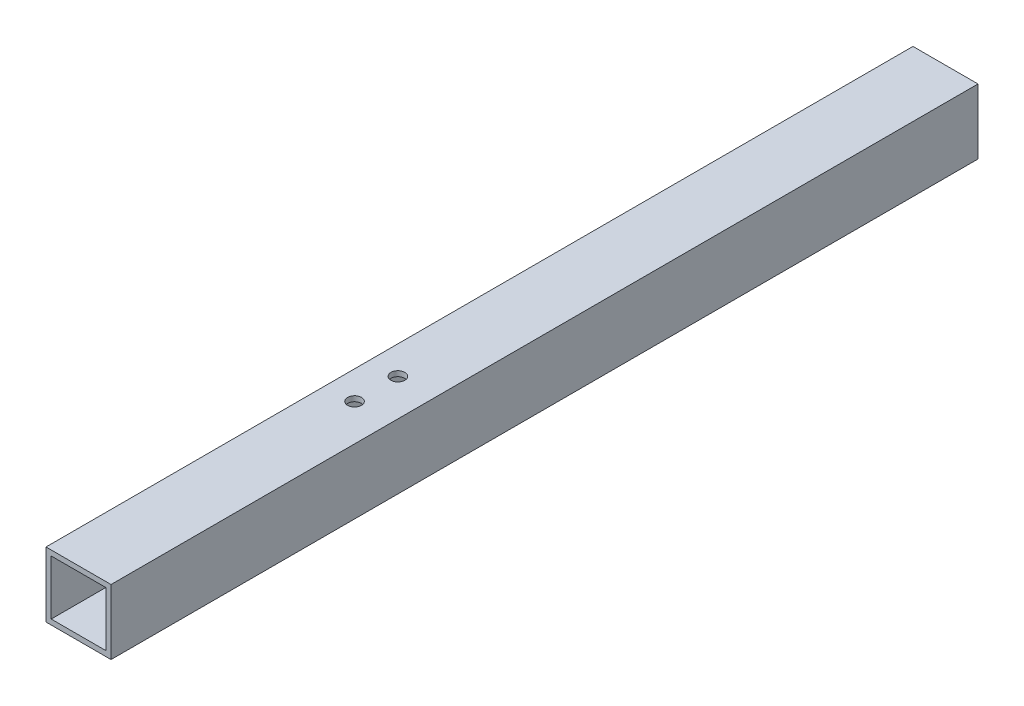
ISO-10303-21;
HEADER;
FILE_DESCRIPTION(('STEP AP214'),'2;1');
FILE_NAME('part.step','',(''),(''),'','','');
FILE_SCHEMA(('AUTOMOTIVE_DESIGN { 1 0 10303 214 1 1 1 1 }'));
ENDSEC;
DATA;
#1=APPLICATION_CONTEXT('core data for automotive mechanical design processes');
#2=APPLICATION_PROTOCOL_DEFINITION('international standard','automotive_design',2000,#1);
#3=PRODUCT_CONTEXT('',#1,'mechanical');
#4=PRODUCT('Part','Part','',(#3));
#5=PRODUCT_RELATED_PRODUCT_CATEGORY('part','',(#4));
#6=PRODUCT_DEFINITION_FORMATION('','',#4);
#7=PRODUCT_DEFINITION_CONTEXT('part definition',#1,'design');
#8=PRODUCT_DEFINITION('design','',#6,#7);
#9=PRODUCT_DEFINITION_SHAPE('','',#8);
#10=(LENGTH_UNIT() NAMED_UNIT(*) SI_UNIT(.MILLI.,.METRE.));
#11=(NAMED_UNIT(*) PLANE_ANGLE_UNIT() SI_UNIT($,.RADIAN.));
#12=(NAMED_UNIT(*) SI_UNIT($,.STERADIAN.) SOLID_ANGLE_UNIT());
#13=UNCERTAINTY_MEASURE_WITH_UNIT(LENGTH_MEASURE(1.E-05),#10,'distance_accuracy_value','');
#14=(GEOMETRIC_REPRESENTATION_CONTEXT(3) GLOBAL_UNCERTAINTY_ASSIGNED_CONTEXT((#13)) GLOBAL_UNIT_ASSIGNED_CONTEXT((#10,
#11,#12)) REPRESENTATION_CONTEXT('',''));
#15=CARTESIAN_POINT('',(0.,0.,0.));
#16=DIRECTION('',(0.,0.,1.));
#17=DIRECTION('',(1.,0.,0.));
#18=AXIS2_PLACEMENT_3D('',#15,#16,#17);
#19=CARTESIAN_POINT('',(0.,0.,200.));
#20=DIRECTION('',(0.,0.,-1.));
#21=DIRECTION('',(-1.,0.,0.));
#22=AXIS2_PLACEMENT_3D('',#19,#20,#21);
#23=PLANE('',#22);
#24=DIRECTION('',(0.,1.,0.));
#25=VECTOR('',#24,1.);
#26=CARTESIAN_POINT('',(7.5,-7.5,200.));
#27=LINE('',#26,#25);
#28=CARTESIAN_POINT('',(7.5,-7.5,200.));
#29=VERTEX_POINT('',#28);
#30=CARTESIAN_POINT('',(7.5,7.5,200.));
#31=VERTEX_POINT('',#30);
#32=EDGE_CURVE('E143',#29,#31,#27,.T.);
#33=ORIENTED_EDGE('',*,*,#32,.T.);
#34=DIRECTION('',(-1.,0.,0.));
#35=VECTOR('',#34,1.);
#36=CARTESIAN_POINT('',(-7.5,7.5,200.));
#37=LINE('',#36,#35);
#38=CARTESIAN_POINT('',(-7.5,7.5,200.));
#39=VERTEX_POINT('',#38);
#40=EDGE_CURVE('E146',#31,#39,#37,.T.);
#41=ORIENTED_EDGE('',*,*,#40,.T.);
#42=DIRECTION('',(0.,-1.,0.));
#43=VECTOR('',#42,1.);
#44=CARTESIAN_POINT('',(-7.5,-7.5,200.));
#45=LINE('',#44,#43);
#46=CARTESIAN_POINT('',(-7.5,-7.5,200.));
#47=VERTEX_POINT('',#46);
#48=EDGE_CURVE('E149',#39,#47,#45,.T.);
#49=ORIENTED_EDGE('',*,*,#48,.T.);
#50=DIRECTION('',(1.,0.,0.));
#51=VECTOR('',#50,1.);
#52=CARTESIAN_POINT('',(-7.5,-7.5,200.));
#53=LINE('',#52,#51);
#54=EDGE_CURVE('E151',#47,#29,#53,.T.);
#55=ORIENTED_EDGE('',*,*,#54,.T.);
#56=EDGE_LOOP('',(#33,#41,#49,#55));
#57=FACE_BOUND('',#56,.T.);
#58=DIRECTION('',(1.,0.,0.));
#59=VECTOR('',#58,1.);
#60=CARTESIAN_POINT('',(-6.3,-6.3,200.));
#61=LINE('',#60,#59);
#62=CARTESIAN_POINT('',(-6.3,-6.3,200.));
#63=VERTEX_POINT('',#62);
#64=CARTESIAN_POINT('',(6.3,-6.3,200.));
#65=VERTEX_POINT('',#64);
#66=EDGE_CURVE('E105',#63,#65,#61,.T.);
#67=ORIENTED_EDGE('',*,*,#66,.F.);
#68=DIRECTION('',(0.,-1.,0.));
#69=VECTOR('',#68,1.);
#70=CARTESIAN_POINT('',(-6.3,-6.3,200.));
#71=LINE('',#70,#69);
#72=CARTESIAN_POINT('',(-6.3,6.3,200.));
#73=VERTEX_POINT('',#72);
#74=EDGE_CURVE('E127',#73,#63,#71,.T.);
#75=ORIENTED_EDGE('',*,*,#74,.F.);
#76=DIRECTION('',(-1.,0.,0.));
#77=VECTOR('',#76,1.);
#78=CARTESIAN_POINT('',(-6.3,6.3,200.));
#79=LINE('',#78,#77);
#80=CARTESIAN_POINT('',(6.3,6.3,200.));
#81=VERTEX_POINT('',#80);
#82=EDGE_CURVE('E125',#81,#73,#79,.T.);
#83=ORIENTED_EDGE('',*,*,#82,.F.);
#84=DIRECTION('',(0.,1.,0.));
#85=VECTOR('',#84,1.);
#86=CARTESIAN_POINT('',(6.3,-6.3,200.));
#87=LINE('',#86,#85);
#88=EDGE_CURVE('E113',#65,#81,#87,.T.);
#89=ORIENTED_EDGE('',*,*,#88,.F.);
#90=EDGE_LOOP('',(#67,#75,#83,#89));
#91=FACE_BOUND('',#90,.T.);
#92=ADVANCED_FACE('F38',(#57,#91),#23,.F.);
#93=CARTESIAN_POINT('',(0.,0.,0.));
#94=DIRECTION('',(0.,0.,-1.));
#95=DIRECTION('',(-1.,0.,0.));
#96=AXIS2_PLACEMENT_3D('',#93,#94,#95);
#97=PLANE('',#96);
#98=DIRECTION('',(0.,1.,0.));
#99=VECTOR('',#98,1.);
#100=CARTESIAN_POINT('',(7.5,-7.5,0.));
#101=LINE('',#100,#99);
#102=CARTESIAN_POINT('',(7.5,-7.5,0.));
#103=VERTEX_POINT('',#102);
#104=CARTESIAN_POINT('',(7.5,7.5,0.));
#105=VERTEX_POINT('',#104);
#106=EDGE_CURVE('E121',#103,#105,#101,.T.);
#107=ORIENTED_EDGE('',*,*,#106,.F.);
#108=DIRECTION('',(1.,0.,0.));
#109=VECTOR('',#108,1.);
#110=CARTESIAN_POINT('',(-7.5,-7.5,0.));
#111=LINE('',#110,#109);
#112=CARTESIAN_POINT('',(-7.5,-7.5,0.));
#113=VERTEX_POINT('',#112);
#114=EDGE_CURVE('E147',#113,#103,#111,.T.);
#115=ORIENTED_EDGE('',*,*,#114,.F.);
#116=DIRECTION('',(0.,-1.,0.));
#117=VECTOR('',#116,1.);
#118=CARTESIAN_POINT('',(-7.5,-7.5,0.));
#119=LINE('',#118,#117);
#120=CARTESIAN_POINT('',(-7.5,7.5,0.));
#121=VERTEX_POINT('',#120);
#122=EDGE_CURVE('E158',#121,#113,#119,.T.);
#123=ORIENTED_EDGE('',*,*,#122,.F.);
#124=DIRECTION('',(-1.,0.,0.));
#125=VECTOR('',#124,1.);
#126=CARTESIAN_POINT('',(-7.5,7.5,0.));
#127=LINE('',#126,#125);
#128=EDGE_CURVE('E156',#105,#121,#127,.T.);
#129=ORIENTED_EDGE('',*,*,#128,.F.);
#130=EDGE_LOOP('',(#107,#115,#123,#129));
#131=FACE_BOUND('',#130,.T.);
#132=DIRECTION('',(0.,-1.,0.));
#133=VECTOR('',#132,1.);
#134=CARTESIAN_POINT('',(-6.3,-6.3,0.));
#135=LINE('',#134,#133);
#136=CARTESIAN_POINT('',(-6.3,6.3,0.));
#137=VERTEX_POINT('',#136);
#138=CARTESIAN_POINT('',(-6.3,-6.3,0.));
#139=VERTEX_POINT('',#138);
#140=EDGE_CURVE('E114',#137,#139,#135,.T.);
#141=ORIENTED_EDGE('',*,*,#140,.T.);
#142=DIRECTION('',(1.,0.,0.));
#143=VECTOR('',#142,1.);
#144=CARTESIAN_POINT('',(-6.3,-6.3,0.));
#145=LINE('',#144,#143);
#146=CARTESIAN_POINT('',(6.3,-6.3,0.));
#147=VERTEX_POINT('',#146);
#148=EDGE_CURVE('E63',#139,#147,#145,.T.);
#149=ORIENTED_EDGE('',*,*,#148,.T.);
#150=DIRECTION('',(0.,1.,0.));
#151=VECTOR('',#150,1.);
#152=CARTESIAN_POINT('',(6.3,-6.3,0.));
#153=LINE('',#152,#151);
#154=CARTESIAN_POINT('',(6.3,6.3,0.));
#155=VERTEX_POINT('',#154);
#156=EDGE_CURVE('E120',#147,#155,#153,.T.);
#157=ORIENTED_EDGE('',*,*,#156,.T.);
#158=DIRECTION('',(-1.,0.,0.));
#159=VECTOR('',#158,1.);
#160=CARTESIAN_POINT('',(-6.3,6.3,0.));
#161=LINE('',#160,#159);
#162=EDGE_CURVE('E135',#155,#137,#161,.T.);
#163=ORIENTED_EDGE('',*,*,#162,.T.);
#164=EDGE_LOOP('',(#141,#149,#157,#163));
#165=FACE_BOUND('',#164,.T.);
#166=ADVANCED_FACE('F205',(#131,#165),#97,.T.);
#167=CARTESIAN_POINT('',(7.5,-7.5,200.));
#168=DIRECTION('',(-1.,0.,0.));
#169=DIRECTION('',(0.,0.,1.));
#170=AXIS2_PLACEMENT_3D('',#167,#168,#169);
#171=PLANE('',#170);
#172=ORIENTED_EDGE('',*,*,#106,.T.);
#173=DIRECTION('',(0.,0.,-1.));
#174=VECTOR('',#173,1.);
#175=CARTESIAN_POINT('',(7.5,7.5,200.));
#176=LINE('',#175,#174);
#177=EDGE_CURVE('E11',#31,#105,#176,.T.);
#178=ORIENTED_EDGE('',*,*,#177,.F.);
#179=ORIENTED_EDGE('',*,*,#32,.F.);
#180=DIRECTION('',(0.,0.,-1.));
#181=VECTOR('',#180,1.);
#182=CARTESIAN_POINT('',(7.5,-7.5,200.));
#183=LINE('',#182,#181);
#184=EDGE_CURVE('E153',#29,#103,#183,.T.);
#185=ORIENTED_EDGE('',*,*,#184,.T.);
#186=EDGE_LOOP('',(#172,#178,#179,#185));
#187=FACE_BOUND('',#186,.T.);
#188=ADVANCED_FACE('F40',(#187),#171,.F.);
#189=CARTESIAN_POINT('',(-7.5,7.5,200.));
#190=DIRECTION('',(0.,-1.,0.));
#191=DIRECTION('',(0.,0.,-1.));
#192=AXIS2_PLACEMENT_3D('',#189,#190,#191);
#193=PLANE('',#192);
#194=CARTESIAN_POINT('',(-0.999999999999959,7.5,125.322387075781));
#195=DIRECTION('',(0.,-1.,0.));
#196=DIRECTION('',(0.,0.,-1.));
#197=AXIS2_PLACEMENT_3D('',#194,#195,#196);
#198=CIRCLE('',#197,1.59999999999982);
#199=CARTESIAN_POINT('',(-0.999999999999959,7.5,123.722387075781));
#200=VERTEX_POINT('',#199);
#201=EDGE_CURVE('E176',#200,#200,#198,.T.);
#202=ORIENTED_EDGE('',*,*,#201,.T.);
#203=EDGE_LOOP('',(#202));
#204=FACE_BOUND('',#203,.T.);
#205=CARTESIAN_POINT('',(-0.999999999999959,7.5,135.322387075781));
#206=DIRECTION('',(0.,-1.,0.));
#207=DIRECTION('',(0.,0.,-1.));
#208=AXIS2_PLACEMENT_3D('',#205,#206,#207);
#209=CIRCLE('',#208,1.59999999999982);
#210=CARTESIAN_POINT('',(-0.999999999999959,7.5,133.722387075781));
#211=VERTEX_POINT('',#210);
#212=EDGE_CURVE('E133',#211,#211,#209,.T.);
#213=ORIENTED_EDGE('',*,*,#212,.T.);
#214=EDGE_LOOP('',(#213));
#215=FACE_BOUND('',#214,.T.);
#216=ORIENTED_EDGE('',*,*,#128,.T.);
#217=DIRECTION('',(0.,0.,-1.));
#218=VECTOR('',#217,1.);
#219=CARTESIAN_POINT('',(-7.5,7.5,200.));
#220=LINE('',#219,#218);
#221=EDGE_CURVE('E47',#39,#121,#220,.T.);
#222=ORIENTED_EDGE('',*,*,#221,.F.);
#223=ORIENTED_EDGE('',*,*,#40,.F.);
#224=ORIENTED_EDGE('',*,*,#177,.T.);
#225=EDGE_LOOP('',(#216,#222,#223,#224));
#226=FACE_BOUND('',#225,.T.);
#227=ADVANCED_FACE('F187',(#204,#215,#226),#193,.F.);
#228=CARTESIAN_POINT('',(-7.5,-7.5,200.));
#229=DIRECTION('',(1.,0.,0.));
#230=DIRECTION('',(0.,0.,-1.));
#231=AXIS2_PLACEMENT_3D('',#228,#229,#230);
#232=PLANE('',#231);
#233=ORIENTED_EDGE('',*,*,#122,.T.);
#234=DIRECTION('',(0.,0.,-1.));
#235=VECTOR('',#234,1.);
#236=CARTESIAN_POINT('',(-7.5,-7.5,200.));
#237=LINE('',#236,#235);
#238=EDGE_CURVE('E163',#47,#113,#237,.T.);
#239=ORIENTED_EDGE('',*,*,#238,.F.);
#240=ORIENTED_EDGE('',*,*,#48,.F.);
#241=ORIENTED_EDGE('',*,*,#221,.T.);
#242=EDGE_LOOP('',(#233,#239,#240,#241));
#243=FACE_BOUND('',#242,.T.);
#244=ADVANCED_FACE('F219',(#243),#232,.F.);
#245=CARTESIAN_POINT('',(-7.5,-7.5,200.));
#246=DIRECTION('',(0.,1.,0.));
#247=DIRECTION('',(0.,0.,1.));
#248=AXIS2_PLACEMENT_3D('',#245,#246,#247);
#249=PLANE('',#248);
#250=CARTESIAN_POINT('',(-0.999999999999959,-7.5,125.322387075781));
#251=DIRECTION('',(0.,-1.,0.));
#252=DIRECTION('',(0.,0.,-1.));
#253=AXIS2_PLACEMENT_3D('',#250,#251,#252);
#254=CIRCLE('',#253,1.59999999999982);
#255=CARTESIAN_POINT('',(-0.999999999999959,-7.5,123.722387075781));
#256=VERTEX_POINT('',#255);
#257=EDGE_CURVE('E242',#256,#256,#254,.T.);
#258=ORIENTED_EDGE('',*,*,#257,.F.);
#259=EDGE_LOOP('',(#258));
#260=FACE_BOUND('',#259,.T.);
#261=CARTESIAN_POINT('',(-0.999999999999959,-7.5,135.322387075781));
#262=DIRECTION('',(0.,-1.,0.));
#263=DIRECTION('',(0.,0.,-1.));
#264=AXIS2_PLACEMENT_3D('',#261,#262,#263);
#265=CIRCLE('',#264,1.59999999999982);
#266=CARTESIAN_POINT('',(-0.999999999999959,-7.5,133.722387075781));
#267=VERTEX_POINT('',#266);
#268=EDGE_CURVE('E170',#267,#267,#265,.T.);
#269=ORIENTED_EDGE('',*,*,#268,.F.);
#270=EDGE_LOOP('',(#269));
#271=FACE_BOUND('',#270,.T.);
#272=ORIENTED_EDGE('',*,*,#114,.T.);
#273=ORIENTED_EDGE('',*,*,#184,.F.);
#274=ORIENTED_EDGE('',*,*,#54,.F.);
#275=ORIENTED_EDGE('',*,*,#238,.T.);
#276=EDGE_LOOP('',(#272,#273,#274,#275));
#277=FACE_BOUND('',#276,.T.);
#278=ADVANCED_FACE('F216',(#260,#271,#277),#249,.F.);
#279=CARTESIAN_POINT('',(-6.3,-6.3,200.));
#280=DIRECTION('',(0.,1.,0.));
#281=DIRECTION('',(0.,0.,1.));
#282=AXIS2_PLACEMENT_3D('',#279,#280,#281);
#283=PLANE('',#282);
#284=CARTESIAN_POINT('',(-0.999999999999959,-6.3,125.322387075781));
#285=DIRECTION('',(0.,1.,0.));
#286=DIRECTION('',(0.,0.,1.));
#287=AXIS2_PLACEMENT_3D('',#284,#285,#286);
#288=CIRCLE('',#287,1.59999999999982);
#289=CARTESIAN_POINT('',(-0.999999999999959,-6.3,126.922387075781));
#290=VERTEX_POINT('',#289);
#291=EDGE_CURVE('E181',#290,#290,#288,.T.);
#292=ORIENTED_EDGE('',*,*,#291,.F.);
#293=EDGE_LOOP('',(#292));
#294=FACE_BOUND('',#293,.T.);
#295=CARTESIAN_POINT('',(-0.999999999999959,-6.3,135.322387075781));
#296=DIRECTION('',(0.,1.,0.));
#297=DIRECTION('',(0.,0.,1.));
#298=AXIS2_PLACEMENT_3D('',#295,#296,#297);
#299=CIRCLE('',#298,1.59999999999982);
#300=CARTESIAN_POINT('',(-0.999999999999959,-6.3,136.922387075781));
#301=VERTEX_POINT('',#300);
#302=EDGE_CURVE('E169',#301,#301,#299,.T.);
#303=ORIENTED_EDGE('',*,*,#302,.F.);
#304=EDGE_LOOP('',(#303));
#305=FACE_BOUND('',#304,.T.);
#306=ORIENTED_EDGE('',*,*,#148,.F.);
#307=DIRECTION('',(0.,0.,-1.));
#308=VECTOR('',#307,1.);
#309=CARTESIAN_POINT('',(-6.3,-6.3,200.));
#310=LINE('',#309,#308);
#311=EDGE_CURVE('E109',#63,#139,#310,.T.);
#312=ORIENTED_EDGE('',*,*,#311,.F.);
#313=ORIENTED_EDGE('',*,*,#66,.T.);
#314=DIRECTION('',(0.,0.,-1.));
#315=VECTOR('',#314,1.);
#316=CARTESIAN_POINT('',(6.3,-6.3,200.));
#317=LINE('',#316,#315);
#318=EDGE_CURVE('E108',#65,#147,#317,.T.);
#319=ORIENTED_EDGE('',*,*,#318,.T.);
#320=EDGE_LOOP('',(#306,#312,#313,#319));
#321=FACE_BOUND('',#320,.T.);
#322=ADVANCED_FACE('F107',(#294,#305,#321),#283,.T.);
#323=CARTESIAN_POINT('',(6.3,-6.3,200.));
#324=DIRECTION('',(-1.,0.,0.));
#325=DIRECTION('',(0.,0.,1.));
#326=AXIS2_PLACEMENT_3D('',#323,#324,#325);
#327=PLANE('',#326);
#328=ORIENTED_EDGE('',*,*,#156,.F.);
#329=ORIENTED_EDGE('',*,*,#318,.F.);
#330=ORIENTED_EDGE('',*,*,#88,.T.);
#331=DIRECTION('',(0.,0.,-1.));
#332=VECTOR('',#331,1.);
#333=CARTESIAN_POINT('',(6.3,6.3,200.));
#334=LINE('',#333,#332);
#335=EDGE_CURVE('E122',#81,#155,#334,.T.);
#336=ORIENTED_EDGE('',*,*,#335,.T.);
#337=EDGE_LOOP('',(#328,#329,#330,#336));
#338=FACE_BOUND('',#337,.T.);
#339=ADVANCED_FACE('F117',(#338),#327,.T.);
#340=CARTESIAN_POINT('',(-6.3,6.3,200.));
#341=DIRECTION('',(0.,-1.,0.));
#342=DIRECTION('',(0.,0.,-1.));
#343=AXIS2_PLACEMENT_3D('',#340,#341,#342);
#344=PLANE('',#343);
#345=CARTESIAN_POINT('',(-0.999999999999959,6.3,125.322387075781));
#346=DIRECTION('',(0.,-1.,0.));
#347=DIRECTION('',(0.,0.,-1.));
#348=AXIS2_PLACEMENT_3D('',#345,#346,#347);
#349=CIRCLE('',#348,1.59999999999982);
#350=CARTESIAN_POINT('',(-0.999999999999959,6.3,123.722387075781));
#351=VERTEX_POINT('',#350);
#352=EDGE_CURVE('E42',#351,#351,#349,.T.);
#353=ORIENTED_EDGE('',*,*,#352,.F.);
#354=EDGE_LOOP('',(#353));
#355=FACE_BOUND('',#354,.T.);
#356=CARTESIAN_POINT('',(-0.999999999999959,6.3,135.322387075781));
#357=DIRECTION('',(0.,-1.,0.));
#358=DIRECTION('',(0.,0.,-1.));
#359=AXIS2_PLACEMENT_3D('',#356,#357,#358);
#360=CIRCLE('',#359,1.59999999999982);
#361=CARTESIAN_POINT('',(-0.999999999999959,6.3,133.722387075781));
#362=VERTEX_POINT('',#361);
#363=EDGE_CURVE('E167',#362,#362,#360,.T.);
#364=ORIENTED_EDGE('',*,*,#363,.F.);
#365=EDGE_LOOP('',(#364));
#366=FACE_BOUND('',#365,.T.);
#367=ORIENTED_EDGE('',*,*,#162,.F.);
#368=ORIENTED_EDGE('',*,*,#335,.F.);
#369=ORIENTED_EDGE('',*,*,#82,.T.);
#370=DIRECTION('',(0.,0.,-1.));
#371=VECTOR('',#370,1.);
#372=CARTESIAN_POINT('',(-6.3,6.3,200.));
#373=LINE('',#372,#371);
#374=EDGE_CURVE('E55',#73,#137,#373,.T.);
#375=ORIENTED_EDGE('',*,*,#374,.T.);
#376=EDGE_LOOP('',(#367,#368,#369,#375));
#377=FACE_BOUND('',#376,.T.);
#378=ADVANCED_FACE('F201',(#355,#366,#377),#344,.T.);
#379=CARTESIAN_POINT('',(-6.3,-6.3,200.));
#380=DIRECTION('',(1.,0.,0.));
#381=DIRECTION('',(0.,0.,-1.));
#382=AXIS2_PLACEMENT_3D('',#379,#380,#381);
#383=PLANE('',#382);
#384=ORIENTED_EDGE('',*,*,#140,.F.);
#385=ORIENTED_EDGE('',*,*,#374,.F.);
#386=ORIENTED_EDGE('',*,*,#74,.T.);
#387=ORIENTED_EDGE('',*,*,#311,.T.);
#388=EDGE_LOOP('',(#384,#385,#386,#387));
#389=FACE_BOUND('',#388,.T.);
#390=ADVANCED_FACE('F193',(#389),#383,.T.);
#391=CARTESIAN_POINT('',(-0.999999999999959,17.5,135.322387075781));
#392=DIRECTION('',(0.,-1.,0.));
#393=DIRECTION('',(0.,0.,-1.));
#394=AXIS2_PLACEMENT_3D('',#391,#392,#393);
#395=CYLINDRICAL_SURFACE('',#394,1.59999999999982);
#396=ORIENTED_EDGE('',*,*,#363,.T.);
#397=EDGE_LOOP('',(#396));
#398=FACE_BOUND('',#397,.T.);
#399=ORIENTED_EDGE('',*,*,#212,.F.);
#400=EDGE_LOOP('',(#399));
#401=FACE_BOUND('',#400,.T.);
#402=ADVANCED_FACE('F190',(#398,#401),#395,.F.);
#403=ORIENTED_EDGE('',*,*,#302,.T.);
#404=EDGE_LOOP('',(#403));
#405=FACE_BOUND('',#404,.T.);
#406=ORIENTED_EDGE('',*,*,#268,.T.);
#407=EDGE_LOOP('',(#406));
#408=FACE_BOUND('',#407,.T.);
#409=ADVANCED_FACE('F192',(#405,#408),#395,.F.);
#410=CARTESIAN_POINT('',(-0.999999999999959,17.5,125.322387075781));
#411=DIRECTION('',(0.,-1.,0.));
#412=DIRECTION('',(0.,0.,-1.));
#413=AXIS2_PLACEMENT_3D('',#410,#411,#412);
#414=CYLINDRICAL_SURFACE('',#413,1.59999999999982);
#415=ORIENTED_EDGE('',*,*,#352,.T.);
#416=EDGE_LOOP('',(#415));
#417=FACE_BOUND('',#416,.T.);
#418=ORIENTED_EDGE('',*,*,#201,.F.);
#419=EDGE_LOOP('',(#418));
#420=FACE_BOUND('',#419,.T.);
#421=ADVANCED_FACE('F199',(#417,#420),#414,.F.);
#422=ORIENTED_EDGE('',*,*,#291,.T.);
#423=EDGE_LOOP('',(#422));
#424=FACE_BOUND('',#423,.T.);
#425=ORIENTED_EDGE('',*,*,#257,.T.);
#426=EDGE_LOOP('',(#425));
#427=FACE_BOUND('',#426,.T.);
#428=ADVANCED_FACE('F233',(#424,#427),#414,.F.);
#429=CLOSED_SHELL('',(#92,#166,#188,#227,#244,#278,#322,#339,#378,#390,#402,#409,#421,#428));
#430=MANIFOLD_SOLID_BREP('B2',#429);
#431=ADVANCED_BREP_SHAPE_REPRESENTATION('',(#18,#430),#14);
#432=SHAPE_DEFINITION_REPRESENTATION(#9,#431);
ENDSEC;
END-ISO-10303-21;
